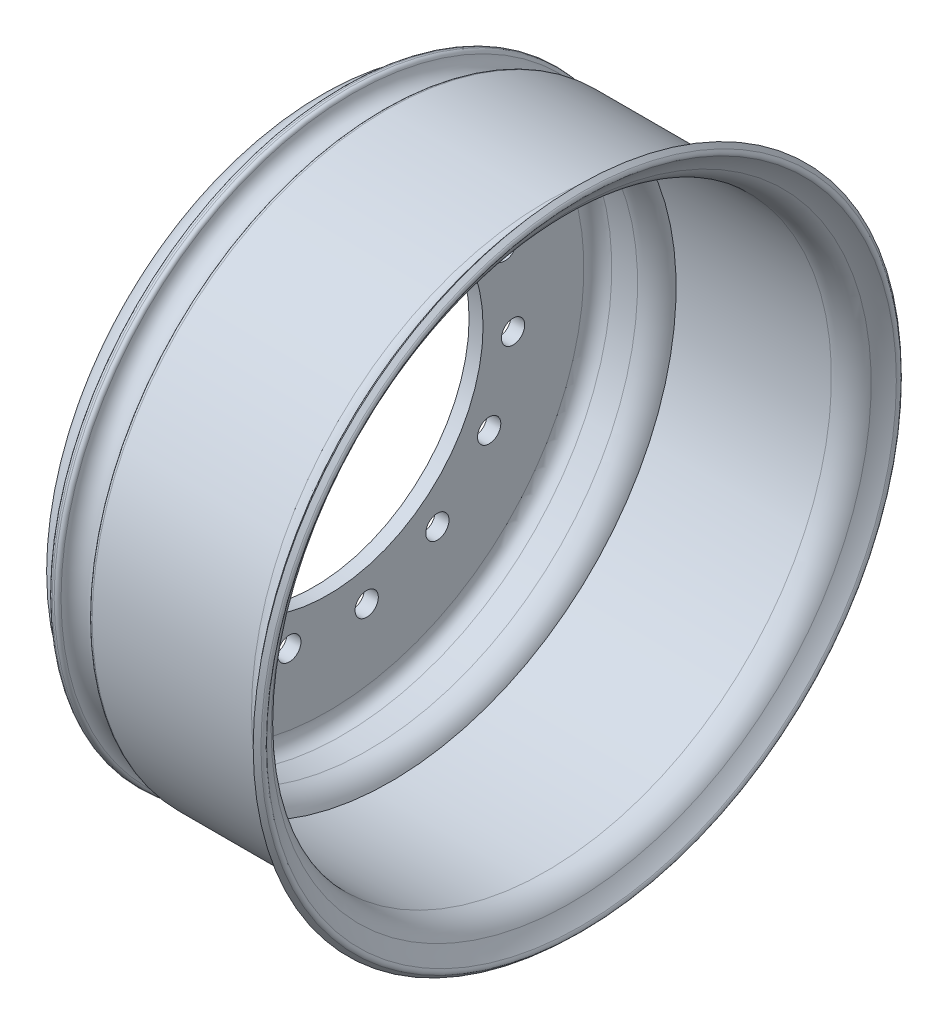
ISO-10303-21;
HEADER;
FILE_DESCRIPTION(('STEP AP214'),'2;1');
FILE_NAME('part.step','',(''),(''),'','','');
FILE_SCHEMA(('AUTOMOTIVE_DESIGN { 1 0 10303 214 1 1 1 1 }'));
ENDSEC;
DATA;
#1=APPLICATION_CONTEXT('core data for automotive mechanical design processes');
#2=APPLICATION_PROTOCOL_DEFINITION('international standard','automotive_design',2000,#1);
#3=PRODUCT_CONTEXT('',#1,'mechanical');
#4=PRODUCT('Part','Part','',(#3));
#5=PRODUCT_RELATED_PRODUCT_CATEGORY('part','',(#4));
#6=PRODUCT_DEFINITION_FORMATION('','',#4);
#7=PRODUCT_DEFINITION_CONTEXT('part definition',#1,'design');
#8=PRODUCT_DEFINITION('design','',#6,#7);
#9=PRODUCT_DEFINITION_SHAPE('','',#8);
#10=(LENGTH_UNIT() NAMED_UNIT(*) SI_UNIT(.MILLI.,.METRE.));
#11=(NAMED_UNIT(*) PLANE_ANGLE_UNIT() SI_UNIT($,.RADIAN.));
#12=(NAMED_UNIT(*) SI_UNIT($,.STERADIAN.) SOLID_ANGLE_UNIT());
#13=UNCERTAINTY_MEASURE_WITH_UNIT(LENGTH_MEASURE(1.E-05),#10,'distance_accuracy_value','');
#14=(GEOMETRIC_REPRESENTATION_CONTEXT(3) GLOBAL_UNCERTAINTY_ASSIGNED_CONTEXT((#13)) GLOBAL_UNIT_ASSIGNED_CONTEXT((#10,
#11,#12)) REPRESENTATION_CONTEXT('',''));
#15=CARTESIAN_POINT('',(0.,0.,0.));
#16=DIRECTION('',(0.,0.,1.));
#17=DIRECTION('',(1.,0.,0.));
#18=AXIS2_PLACEMENT_3D('',#15,#16,#17);
#19=CARTESIAN_POINT('',(16.,0.,0.));
#20=DIRECTION('',(-1.,0.,0.));
#21=DIRECTION('',(0.,0.,1.));
#22=AXIS2_PLACEMENT_3D('',#19,#20,#21);
#23=TOROIDAL_SURFACE('',#22,190.,10.);
#24=CARTESIAN_POINT('',(25.7979589711458,0.,0.));
#25=DIRECTION('',(-1.,0.,0.));
#26=DIRECTION('',(0.,0.,1.));
#27=AXIS2_PLACEMENT_3D('',#24,#25,#26);
#28=CIRCLE('',#27,187.999999999997);
#29=CARTESIAN_POINT('',(25.7979589711458,0.,187.999999999997));
#30=VERTEX_POINT('',#29);
#31=EDGE_CURVE('E55',#30,#30,#28,.T.);
#32=ORIENTED_EDGE('',*,*,#31,.T.);
#33=EDGE_LOOP('',(#32));
#34=FACE_BOUND('',#33,.T.);
#35=CARTESIAN_POINT('',(6.20204102885423,0.,0.));
#36=DIRECTION('',(1.,0.,0.));
#37=DIRECTION('',(0.,0.,-1.));
#38=AXIS2_PLACEMENT_3D('',#35,#36,#37);
#39=CIRCLE('',#38,187.999999999997);
#40=CARTESIAN_POINT('',(6.20204102885423,0.,-187.999999999997));
#41=VERTEX_POINT('',#40);
#42=EDGE_CURVE('E58',#41,#41,#39,.T.);
#43=ORIENTED_EDGE('',*,*,#42,.T.);
#44=EDGE_LOOP('',(#43));
#45=FACE_BOUND('',#44,.T.);
#46=ADVANCED_FACE('F35',(#34,#45),#23,.F.);
#47=CARTESIAN_POINT('',(0.,0.,0.));
#48=DIRECTION('',(-1.,0.,0.));
#49=DIRECTION('',(0.,0.,1.));
#50=AXIS2_PLACEMENT_3D('',#47,#48,#49);
#51=CYLINDRICAL_SURFACE('',#50,190.);
#52=CARTESIAN_POINT('',(28.2474487139159,0.,0.));
#53=DIRECTION('',(1.,0.,0.));
#54=DIRECTION('',(0.,0.,-1.));
#55=AXIS2_PLACEMENT_3D('',#52,#53,#54);
#56=CIRCLE('',#55,190.);
#57=CARTESIAN_POINT('',(28.2474487139159,0.,-190.));
#58=VERTEX_POINT('',#57);
#59=EDGE_CURVE('E50',#58,#58,#56,.T.);
#60=ORIENTED_EDGE('',*,*,#59,.T.);
#61=EDGE_LOOP('',(#60));
#62=FACE_BOUND('',#61,.T.);
#63=CARTESIAN_POINT('',(131.,0.,0.));
#64=DIRECTION('',(-1.,0.,0.));
#65=DIRECTION('',(0.,0.,1.));
#66=AXIS2_PLACEMENT_3D('',#63,#64,#65);
#67=CIRCLE('',#66,190.);
#68=CARTESIAN_POINT('',(131.,0.,190.));
#69=VERTEX_POINT('',#68);
#70=EDGE_CURVE('E67',#69,#69,#67,.T.);
#71=ORIENTED_EDGE('',*,*,#70,.T.);
#72=EDGE_LOOP('',(#71));
#73=FACE_BOUND('',#72,.T.);
#74=ADVANCED_FACE('F265',(#62,#73),#51,.T.);
#75=CARTESIAN_POINT('',(131.,0.,0.));
#76=DIRECTION('',(-1.,0.,0.));
#77=DIRECTION('',(0.,0.,1.));
#78=AXIS2_PLACEMENT_3D('',#75,#76,#77);
#79=TOROIDAL_SURFACE('',#78,202.5,12.5);
#80=ORIENTED_EDGE('',*,*,#70,.F.);
#81=EDGE_LOOP('',(#80));
#82=FACE_BOUND('',#81,.T.);
#83=CARTESIAN_POINT('',(141.912662215864,0.,0.));
#84=DIRECTION('',(-1.,0.,0.));
#85=DIRECTION('',(0.,0.,1.));
#86=AXIS2_PLACEMENT_3D('',#83,#84,#85);
#87=CIRCLE('',#86,196.403787785644);
#88=CARTESIAN_POINT('',(141.912662215864,0.,196.403787785644));
#89=VERTEX_POINT('',#88);
#90=EDGE_CURVE('E70',#89,#89,#87,.T.);
#91=ORIENTED_EDGE('',*,*,#90,.T.);
#92=EDGE_LOOP('',(#91));
#93=FACE_BOUND('',#92,.T.);
#94=ADVANCED_FACE('F271',(#82,#93),#79,.F.);
#95=CARTESIAN_POINT('',(198.658505738355,0.,0.));
#96=DIRECTION('',(-1.,0.,0.));
#97=DIRECTION('',(0.,0.,1.));
#98=AXIS2_PLACEMENT_3D('',#95,#96,#97);
#99=TOROIDAL_SURFACE('',#98,164.703484270994,65.);
#100=ORIENTED_EDGE('',*,*,#90,.F.);
#101=EDGE_LOOP('',(#100));
#102=FACE_BOUND('',#101,.T.);
#103=CARTESIAN_POINT('',(151.,0.,0.));
#104=DIRECTION('',(-1.,0.,0.));
#105=DIRECTION('',(0.,0.,1.));
#106=AXIS2_PLACEMENT_3D('',#103,#104,#105);
#107=CIRCLE('',#106,208.903787785644);
#108=CARTESIAN_POINT('',(151.,0.,208.903787785644));
#109=VERTEX_POINT('',#108);
#110=EDGE_CURVE('E73',#109,#109,#107,.T.);
#111=ORIENTED_EDGE('',*,*,#110,.T.);
#112=EDGE_LOOP('',(#111));
#113=FACE_BOUND('',#112,.T.);
#114=ADVANCED_FACE('F374',(#102,#113),#99,.T.);
#115=CARTESIAN_POINT('',(155.39924668354,0.,0.));
#116=DIRECTION('',(-1.,0.,0.));
#117=DIRECTION('',(0.,0.,1.));
#118=AXIS2_PLACEMENT_3D('',#115,#116,#117);
#119=CONICAL_SURFACE('',#118,204.823759768907,0.747769003171668);
#120=CARTESIAN_POINT('',(153.603499128886,0.,0.));
#121=DIRECTION('',(1.,0.,0.));
#122=DIRECTION('',(0.,0.,-1.));
#123=AXIS2_PLACEMENT_3D('',#120,#121,#122);
#124=CIRCLE('',#123,206.489204073586);
#125=CARTESIAN_POINT('',(153.603499128886,0.,-206.489204073586));
#126=VERTEX_POINT('',#125);
#127=EDGE_CURVE('E64',#126,#126,#124,.F.);
#128=ORIENTED_EDGE('',*,*,#127,.T.);
#129=EDGE_LOOP('',(#128));
#130=FACE_BOUND('',#129,.T.);
#131=ORIENTED_EDGE('',*,*,#110,.F.);
#132=EDGE_LOOP('',(#131));
#133=FACE_BOUND('',#132,.T.);
#134=ADVANCED_FACE('F361',(#130,#133),#119,.T.);
#135=CARTESIAN_POINT('',(198.658505738355,0.,0.));
#136=DIRECTION('',(-1.,0.,0.));
#137=DIRECTION('',(0.,0.,1.));
#138=AXIS2_PLACEMENT_3D('',#135,#136,#137);
#139=TOROIDAL_SURFACE('',#138,164.703484270994,59.);
#140=CARTESIAN_POINT('',(153.804097954559,0.,0.));
#141=DIRECTION('',(1.,0.,0.));
#142=DIRECTION('',(0.,0.,-1.));
#143=AXIS2_PLACEMENT_3D('',#140,#141,#142);
#144=CIRCLE('',#143,203.032091111903);
#145=CARTESIAN_POINT('',(153.804097954559,0.,-203.032091111903));
#146=VERTEX_POINT('',#145);
#147=EDGE_CURVE('E61',#146,#146,#144,.T.);
#148=ORIENTED_EDGE('',*,*,#147,.T.);
#149=EDGE_LOOP('',(#148));
#150=FACE_BOUND('',#149,.T.);
#151=CARTESIAN_POINT('',(147.150740079478,0.,0.));
#152=DIRECTION('',(-1.,0.,0.));
#153=DIRECTION('',(0.,0.,1.));
#154=AXIS2_PLACEMENT_3D('',#151,#152,#153);
#155=CIRCLE('',#154,193.477605922753);
#156=CARTESIAN_POINT('',(147.150740079478,0.,193.477605922753));
#157=VERTEX_POINT('',#156);
#158=EDGE_CURVE('E76',#157,#157,#155,.T.);
#159=ORIENTED_EDGE('',*,*,#158,.T.);
#160=EDGE_LOOP('',(#159));
#161=FACE_BOUND('',#160,.T.);
#162=ADVANCED_FACE('F355',(#150,#161),#139,.F.);
#163=CARTESIAN_POINT('',(131.,0.,0.));
#164=DIRECTION('',(-1.,0.,0.));
#165=DIRECTION('',(0.,0.,1.));
#166=AXIS2_PLACEMENT_3D('',#163,#164,#165);
#167=TOROIDAL_SURFACE('',#166,202.5,18.5);
#168=ORIENTED_EDGE('',*,*,#158,.F.);
#169=EDGE_LOOP('',(#168));
#170=FACE_BOUND('',#169,.T.);
#171=CARTESIAN_POINT('',(131.,0.,0.));
#172=DIRECTION('',(-1.,0.,0.));
#173=DIRECTION('',(0.,0.,1.));
#174=AXIS2_PLACEMENT_3D('',#171,#172,#173);
#175=CIRCLE('',#174,184.);
#176=CARTESIAN_POINT('',(131.,0.,184.));
#177=VERTEX_POINT('',#176);
#178=EDGE_CURVE('E79',#177,#177,#175,.T.);
#179=ORIENTED_EDGE('',*,*,#178,.T.);
#180=EDGE_LOOP('',(#179));
#181=FACE_BOUND('',#180,.T.);
#182=ADVANCED_FACE('F360',(#170,#181),#167,.T.);
#183=CARTESIAN_POINT('',(0.,0.,0.));
#184=DIRECTION('',(-1.,0.,0.));
#185=DIRECTION('',(0.,0.,1.));
#186=AXIS2_PLACEMENT_3D('',#183,#184,#185);
#187=CYLINDRICAL_SURFACE('',#186,184.);
#188=ORIENTED_EDGE('',*,*,#178,.F.);
#189=EDGE_LOOP('',(#188));
#190=FACE_BOUND('',#189,.T.);
#191=CARTESIAN_POINT('',(30.8323969741913,0.,0.));
#192=DIRECTION('',(-1.,0.,0.));
#193=DIRECTION('',(0.,0.,1.));
#194=AXIS2_PLACEMENT_3D('',#191,#192,#193);
#195=CIRCLE('',#194,184.);
#196=CARTESIAN_POINT('',(30.8323969741913,0.,184.));
#197=VERTEX_POINT('',#196);
#198=EDGE_CURVE('E82',#197,#197,#195,.T.);
#199=ORIENTED_EDGE('',*,*,#198,.T.);
#200=EDGE_LOOP('',(#199));
#201=FACE_BOUND('',#200,.T.);
#202=ADVANCED_FACE('F622',(#190,#201),#187,.F.);
#203=CARTESIAN_POINT('',(16.,0.,0.));
#204=DIRECTION('',(-1.,0.,0.));
#205=DIRECTION('',(0.,0.,1.));
#206=AXIS2_PLACEMENT_3D('',#203,#204,#205);
#207=TOROIDAL_SURFACE('',#206,190.,16.);
#208=ORIENTED_EDGE('',*,*,#198,.F.);
#209=EDGE_LOOP('',(#208));
#210=FACE_BOUND('',#209,.T.);
#211=CARTESIAN_POINT('',(16.,0.,0.));
#212=DIRECTION('',(-1.,0.,0.));
#213=DIRECTION('',(0.,0.,1.));
#214=AXIS2_PLACEMENT_3D('',#211,#212,#213);
#215=CIRCLE('',#214,174.);
#216=CARTESIAN_POINT('',(16.,0.,174.));
#217=VERTEX_POINT('',#216);
#218=EDGE_CURVE('E85',#217,#217,#215,.T.);
#219=ORIENTED_EDGE('',*,*,#218,.T.);
#220=EDGE_LOOP('',(#219));
#221=FACE_BOUND('',#220,.T.);
#222=ADVANCED_FACE('F611',(#210,#221),#207,.T.);
#223=CARTESIAN_POINT('',(0.,0.,0.));
#224=DIRECTION('',(-1.,0.,0.));
#225=DIRECTION('',(0.,0.,1.));
#226=AXIS2_PLACEMENT_3D('',#223,#224,#225);
#227=CYLINDRICAL_SURFACE('',#226,174.);
#228=ORIENTED_EDGE('',*,*,#218,.F.);
#229=EDGE_LOOP('',(#228));
#230=FACE_BOUND('',#229,.T.);
#231=CARTESIAN_POINT('',(-0.654113463673033,0.,0.));
#232=DIRECTION('',(-1.,0.,0.));
#233=DIRECTION('',(0.,0.,1.));
#234=AXIS2_PLACEMENT_3D('',#231,#232,#233);
#235=CIRCLE('',#234,174.);
#236=CARTESIAN_POINT('',(-0.654113463673033,0.,174.));
#237=VERTEX_POINT('',#236);
#238=EDGE_CURVE('E88',#237,#237,#235,.T.);
#239=ORIENTED_EDGE('',*,*,#238,.T.);
#240=EDGE_LOOP('',(#239));
#241=FACE_BOUND('',#240,.T.);
#242=ADVANCED_FACE('F600',(#230,#241),#227,.F.);
#243=CARTESIAN_POINT('',(-0.654113463673034,0.,0.));
#244=DIRECTION('',(-1.,0.,0.));
#245=DIRECTION('',(0.,0.,1.));
#246=AXIS2_PLACEMENT_3D('',#243,#244,#245);
#247=TOROIDAL_SURFACE('',#246,165.,9.00000000000001);
#248=ORIENTED_EDGE('',*,*,#238,.F.);
#249=EDGE_LOOP('',(#248));
#250=FACE_BOUND('',#249,.T.);
#251=CARTESIAN_POINT('',(-9.65411346367303,0.,0.));
#252=DIRECTION('',(-1.,0.,0.));
#253=DIRECTION('',(0.,0.,1.));
#254=AXIS2_PLACEMENT_3D('',#251,#252,#253);
#255=CIRCLE('',#254,165.);
#256=CARTESIAN_POINT('',(-9.65411346367303,0.,165.));
#257=VERTEX_POINT('',#256);
#258=EDGE_CURVE('E91',#257,#257,#255,.T.);
#259=ORIENTED_EDGE('',*,*,#258,.T.);
#260=EDGE_LOOP('',(#259));
#261=FACE_BOUND('',#260,.T.);
#262=ADVANCED_FACE('F547',(#250,#261),#247,.F.);
#263=CARTESIAN_POINT('',(-9.65411346367303,165.,0.));
#264=DIRECTION('',(-1.,0.,0.));
#265=DIRECTION('',(0.,0.,1.));
#266=AXIS2_PLACEMENT_3D('',#263,#264,#265);
#267=PLANE('',#266);
#268=CARTESIAN_POINT('',(-9.65411346367304,80.2956727630628,-89.1773790572875));
#269=DIRECTION('',(-1.,0.,0.));
#270=DIRECTION('',(0.,0.,1.));
#271=AXIS2_PLACEMENT_3D('',#268,#269,#270);
#272=CIRCLE('',#271,7.5);
#273=CARTESIAN_POINT('',(-9.65411346367304,80.2956727630628,-81.6773790572875));
#274=VERTEX_POINT('',#273);
#275=EDGE_CURVE('E121',#274,#274,#272,.T.);
#276=ORIENTED_EDGE('',*,*,#275,.T.);
#277=EDGE_LOOP('',(#276));
#278=FACE_BOUND('',#277,.T.);
#279=CARTESIAN_POINT('',(-9.65411346367304,37.0820393249934,-114.126781955419));
#280=DIRECTION('',(-1.,0.,0.));
#281=DIRECTION('',(0.,0.,1.));
#282=AXIS2_PLACEMENT_3D('',#279,#280,#281);
#283=CIRCLE('',#282,7.5);
#284=CARTESIAN_POINT('',(-9.65411346367304,37.0820393249934,-106.626781955419));
#285=VERTEX_POINT('',#284);
#286=EDGE_CURVE('E124',#285,#285,#283,.T.);
#287=ORIENTED_EDGE('',*,*,#286,.T.);
#288=EDGE_LOOP('',(#287));
#289=FACE_BOUND('',#288,.T.);
#290=CARTESIAN_POINT('',(-9.65411346367304,-12.5434155921189,-119.342627444193));
#291=DIRECTION('',(-1.,0.,0.));
#292=DIRECTION('',(0.,0.,1.));
#293=AXIS2_PLACEMENT_3D('',#290,#291,#292);
#294=CIRCLE('',#293,7.5);
#295=CARTESIAN_POINT('',(-9.65411346367304,-12.5434155921189,-111.842627444193));
#296=VERTEX_POINT('',#295);
#297=EDGE_CURVE('E127',#296,#296,#294,.T.);
#298=ORIENTED_EDGE('',*,*,#297,.T.);
#299=EDGE_LOOP('',(#298));
#300=FACE_BOUND('',#299,.T.);
#301=CARTESIAN_POINT('',(-9.65411346367304,-60.0000000000005,-103.923048454132));
#302=DIRECTION('',(-1.,0.,0.));
#303=DIRECTION('',(0.,0.,1.));
#304=AXIS2_PLACEMENT_3D('',#301,#302,#303);
#305=CIRCLE('',#304,7.5);
#306=CARTESIAN_POINT('',(-9.65411346367304,-60.0000000000005,-96.4230484541324));
#307=VERTEX_POINT('',#306);
#308=EDGE_CURVE('E130',#307,#307,#305,.T.);
#309=ORIENTED_EDGE('',*,*,#308,.T.);
#310=EDGE_LOOP('',(#309));
#311=FACE_BOUND('',#310,.T.);
#312=CARTESIAN_POINT('',(-9.65411346367304,-97.0820393249941,-70.5342302750963));
#313=DIRECTION('',(-1.,0.,0.));
#314=DIRECTION('',(0.,0.,1.));
#315=AXIS2_PLACEMENT_3D('',#312,#313,#314);
#316=CIRCLE('',#315,7.5);
#317=CARTESIAN_POINT('',(-9.65411346367304,-97.0820393249941,-63.0342302750963));
#318=VERTEX_POINT('',#317);
#319=EDGE_CURVE('E133',#318,#318,#316,.T.);
#320=ORIENTED_EDGE('',*,*,#319,.T.);
#321=EDGE_LOOP('',(#320));
#322=FACE_BOUND('',#321,.T.);
#323=CARTESIAN_POINT('',(-9.65411346367304,-117.377712088057,-24.9494028981304));
#324=DIRECTION('',(-1.,0.,0.));
#325=DIRECTION('',(0.,0.,1.));
#326=AXIS2_PLACEMENT_3D('',#323,#324,#325);
#327=CIRCLE('',#326,7.5);
#328=CARTESIAN_POINT('',(-9.65411346367304,-117.377712088057,-17.4494028981304));
#329=VERTEX_POINT('',#328);
#330=EDGE_CURVE('E136',#329,#329,#327,.T.);
#331=ORIENTED_EDGE('',*,*,#330,.T.);
#332=EDGE_LOOP('',(#331));
#333=FACE_BOUND('',#332,.T.);
#334=CARTESIAN_POINT('',(-9.65411346367304,-117.377712088056,24.949402898132));
#335=DIRECTION('',(-1.,0.,0.));
#336=DIRECTION('',(0.,0.,1.));
#337=AXIS2_PLACEMENT_3D('',#334,#335,#336);
#338=CIRCLE('',#337,7.5);
#339=CARTESIAN_POINT('',(-9.65411346367304,-117.377712088056,32.449402898132));
#340=VERTEX_POINT('',#339);
#341=EDGE_CURVE('E139',#340,#340,#338,.T.);
#342=ORIENTED_EDGE('',*,*,#341,.T.);
#343=EDGE_LOOP('',(#342));
#344=FACE_BOUND('',#343,.T.);
#345=CARTESIAN_POINT('',(-9.65411346367304,-97.0820393249931,70.5342302750976));
#346=DIRECTION('',(-1.,0.,0.));
#347=DIRECTION('',(0.,0.,1.));
#348=AXIS2_PLACEMENT_3D('',#345,#346,#347);
#349=CIRCLE('',#348,7.5);
#350=CARTESIAN_POINT('',(-9.65411346367304,-97.0820393249931,78.0342302750976));
#351=VERTEX_POINT('',#350);
#352=EDGE_CURVE('E142',#351,#351,#349,.T.);
#353=ORIENTED_EDGE('',*,*,#352,.T.);
#354=EDGE_LOOP('',(#353));
#355=FACE_BOUND('',#354,.T.);
#356=CARTESIAN_POINT('',(-9.65411346367304,-59.999999999999,103.923048454133));
#357=DIRECTION('',(-1.,0.,0.));
#358=DIRECTION('',(0.,0.,1.));
#359=AXIS2_PLACEMENT_3D('',#356,#357,#358);
#360=CIRCLE('',#359,7.5);
#361=CARTESIAN_POINT('',(-9.65411346367304,-59.999999999999,111.423048454133));
#362=VERTEX_POINT('',#361);
#363=EDGE_CURVE('E145',#362,#362,#360,.T.);
#364=ORIENTED_EDGE('',*,*,#363,.T.);
#365=EDGE_LOOP('',(#364));
#366=FACE_BOUND('',#365,.T.);
#367=CARTESIAN_POINT('',(-9.65411346367304,-12.5434155921172,119.342627444193));
#368=DIRECTION('',(-1.,0.,0.));
#369=DIRECTION('',(0.,0.,1.));
#370=AXIS2_PLACEMENT_3D('',#367,#368,#369);
#371=CIRCLE('',#370,7.5);
#372=CARTESIAN_POINT('',(-9.65411346367304,-12.5434155921172,126.842627444193));
#373=VERTEX_POINT('',#372);
#374=EDGE_CURVE('E148',#373,#373,#371,.T.);
#375=ORIENTED_EDGE('',*,*,#374,.T.);
#376=EDGE_LOOP('',(#375));
#377=FACE_BOUND('',#376,.T.);
#378=CARTESIAN_POINT('',(-9.65411346367304,37.0820393249949,114.126781955418));
#379=DIRECTION('',(-1.,0.,0.));
#380=DIRECTION('',(0.,0.,1.));
#381=AXIS2_PLACEMENT_3D('',#378,#379,#380);
#382=CIRCLE('',#381,7.5);
#383=CARTESIAN_POINT('',(-9.65411346367304,37.0820393249949,121.626781955418));
#384=VERTEX_POINT('',#383);
#385=EDGE_CURVE('E151',#384,#384,#382,.T.);
#386=ORIENTED_EDGE('',*,*,#385,.T.);
#387=EDGE_LOOP('',(#386));
#388=FACE_BOUND('',#387,.T.);
#389=CARTESIAN_POINT('',(-9.65411346367304,80.2956727630641,89.1773790572863));
#390=DIRECTION('',(-1.,0.,0.));
#391=DIRECTION('',(0.,0.,1.));
#392=AXIS2_PLACEMENT_3D('',#389,#390,#391);
#393=CIRCLE('',#392,7.5);
#394=CARTESIAN_POINT('',(-9.65411346367304,80.2956727630641,96.6773790572863));
#395=VERTEX_POINT('',#394);
#396=EDGE_CURVE('E154',#395,#395,#393,.T.);
#397=ORIENTED_EDGE('',*,*,#396,.T.);
#398=EDGE_LOOP('',(#397));
#399=FACE_BOUND('',#398,.T.);
#400=CARTESIAN_POINT('',(-9.65411346367304,109.625454917113,48.8083971690947));
#401=DIRECTION('',(-1.,0.,0.));
#402=DIRECTION('',(0.,0.,1.));
#403=AXIS2_PLACEMENT_3D('',#400,#401,#402);
#404=CIRCLE('',#403,7.5);
#405=CARTESIAN_POINT('',(-9.65411346367304,109.625454917113,56.3083971690947));
#406=VERTEX_POINT('',#405);
#407=EDGE_CURVE('E157',#406,#406,#404,.T.);
#408=ORIENTED_EDGE('',*,*,#407,.T.);
#409=EDGE_LOOP('',(#408));
#410=FACE_BOUND('',#409,.T.);
#411=CARTESIAN_POINT('',(-9.65411346367304,109.625454917112,-48.8083971690961));
#412=DIRECTION('',(-1.,0.,0.));
#413=DIRECTION('',(0.,0.,1.));
#414=AXIS2_PLACEMENT_3D('',#411,#412,#413);
#415=CIRCLE('',#414,7.5);
#416=CARTESIAN_POINT('',(-9.65411346367304,109.625454917112,-41.3083971690961));
#417=VERTEX_POINT('',#416);
#418=EDGE_CURVE('E160',#417,#417,#415,.T.);
#419=ORIENTED_EDGE('',*,*,#418,.T.);
#420=EDGE_LOOP('',(#419));
#421=FACE_BOUND('',#420,.T.);
#422=CARTESIAN_POINT('',(-9.65411346367304,120.,0.));
#423=DIRECTION('',(-1.,0.,0.));
#424=DIRECTION('',(0.,0.,1.));
#425=AXIS2_PLACEMENT_3D('',#422,#423,#424);
#426=CIRCLE('',#425,7.5);
#427=CARTESIAN_POINT('',(-9.65411346367304,120.,7.5));
#428=VERTEX_POINT('',#427);
#429=EDGE_CURVE('E115',#428,#428,#426,.T.);
#430=ORIENTED_EDGE('',*,*,#429,.T.);
#431=EDGE_LOOP('',(#430));
#432=FACE_BOUND('',#431,.T.);
#433=ORIENTED_EDGE('',*,*,#258,.F.);
#434=EDGE_LOOP('',(#433));
#435=FACE_BOUND('',#434,.T.);
#436=CARTESIAN_POINT('',(-9.65411346367302,0.,0.));
#437=DIRECTION('',(-1.,0.,0.));
#438=DIRECTION('',(0.,0.,1.));
#439=AXIS2_PLACEMENT_3D('',#436,#437,#438);
#440=CIRCLE('',#439,100.);
#441=CARTESIAN_POINT('',(-9.65411346367302,0.,100.));
#442=VERTEX_POINT('',#441);
#443=EDGE_CURVE('E94',#442,#442,#440,.T.);
#444=ORIENTED_EDGE('',*,*,#443,.T.);
#445=EDGE_LOOP('',(#444));
#446=FACE_BOUND('',#445,.T.);
#447=ADVANCED_FACE('F542',(#278,#289,#300,#311,#322,#333,#344,#355,#366,#377,#388,#399,#410,
#421,#432,#435,#446),#267,.F.);
#448=CARTESIAN_POINT('',(0.,0.,0.));
#449=DIRECTION('',(-1.,0.,0.));
#450=DIRECTION('',(0.,0.,1.));
#451=AXIS2_PLACEMENT_3D('',#448,#449,#450);
#452=CYLINDRICAL_SURFACE('',#451,100.);
#453=ORIENTED_EDGE('',*,*,#443,.F.);
#454=EDGE_LOOP('',(#453));
#455=FACE_BOUND('',#454,.T.);
#456=CARTESIAN_POINT('',(-18.654113463673,0.,0.));
#457=DIRECTION('',(-1.,0.,0.));
#458=DIRECTION('',(0.,0.,1.));
#459=AXIS2_PLACEMENT_3D('',#456,#457,#458);
#460=CIRCLE('',#459,100.);
#461=CARTESIAN_POINT('',(-18.654113463673,0.,100.));
#462=VERTEX_POINT('',#461);
#463=EDGE_CURVE('E97',#462,#462,#460,.T.);
#464=ORIENTED_EDGE('',*,*,#463,.T.);
#465=EDGE_LOOP('',(#464));
#466=FACE_BOUND('',#465,.T.);
#467=ADVANCED_FACE('F213',(#455,#466),#452,.F.);
#468=CARTESIAN_POINT('',(-18.654113463673,165.,0.));
#469=DIRECTION('',(1.,0.,0.));
#470=DIRECTION('',(0.,0.,-1.));
#471=AXIS2_PLACEMENT_3D('',#468,#469,#470);
#472=PLANE('',#471);
#473=CARTESIAN_POINT('',(-18.654113463673,80.2956727630628,-89.1773790572875));
#474=DIRECTION('',(-1.,0.,0.));
#475=DIRECTION('',(0.,0.743144825477395,0.669130606358857));
#476=AXIS2_PLACEMENT_3D('',#473,#474,#475);
#477=CIRCLE('',#476,7.5);
#478=CARTESIAN_POINT('',(-18.654113463673,85.8692589541433,-84.158899509596));
#479=VERTEX_POINT('',#478);
#480=EDGE_CURVE('E166',#479,#479,#477,.T.);
#481=ORIENTED_EDGE('',*,*,#480,.F.);
#482=EDGE_LOOP('',(#481));
#483=FACE_BOUND('',#482,.T.);
#484=CARTESIAN_POINT('',(-18.654113463673,37.0820393249934,-114.126781955419));
#485=DIRECTION('',(-1.,0.,0.));
#486=DIRECTION('',(0.,0.951056516295154,0.309016994374945));
#487=AXIS2_PLACEMENT_3D('',#484,#485,#486);
#488=CIRCLE('',#487,7.5);
#489=CARTESIAN_POINT('',(-18.654113463673,44.2149631972071,-111.809154497606));
#490=VERTEX_POINT('',#489);
#491=EDGE_CURVE('E186',#490,#490,#488,.T.);
#492=ORIENTED_EDGE('',*,*,#491,.F.);
#493=EDGE_LOOP('',(#492));
#494=FACE_BOUND('',#493,.T.);
#495=CARTESIAN_POINT('',(-18.654113463673,-12.5434155921189,-119.342627444193));
#496=DIRECTION('',(-1.,0.,0.));
#497=DIRECTION('',(0.,0.994521895368273,-0.104528463267657));
#498=AXIS2_PLACEMENT_3D('',#495,#496,#497);
#499=CIRCLE('',#498,7.5);
#500=CARTESIAN_POINT('',(-18.654113463673,-5.0845013768568,-120.1265909187));
#501=VERTEX_POINT('',#500);
#502=EDGE_CURVE('E183',#501,#501,#499,.T.);
#503=ORIENTED_EDGE('',*,*,#502,.F.);
#504=EDGE_LOOP('',(#503));
#505=FACE_BOUND('',#504,.T.);
#506=CARTESIAN_POINT('',(-18.654113463673,-60.0000000000005,-103.923048454132));
#507=DIRECTION('',(-1.,0.,0.));
#508=DIRECTION('',(0.,0.866025403784436,-0.500000000000004));
#509=AXIS2_PLACEMENT_3D('',#506,#507,#508);
#510=CIRCLE('',#509,7.5);
#511=CARTESIAN_POINT('',(-18.654113463673,-53.5048094716172,-107.673048454132));
#512=VERTEX_POINT('',#511);
#513=EDGE_CURVE('E180',#512,#512,#510,.T.);
#514=ORIENTED_EDGE('',*,*,#513,.F.);
#515=EDGE_LOOP('',(#514));
#516=FACE_BOUND('',#515,.T.);
#517=CARTESIAN_POINT('',(-18.654113463673,-97.0820393249941,-70.5342302750963));
#518=DIRECTION('',(-1.,0.,0.));
#519=DIRECTION('',(0.,0.587785252292469,-0.80901699437495));
#520=AXIS2_PLACEMENT_3D('',#517,#518,#519);
#521=CIRCLE('',#520,7.5);
#522=CARTESIAN_POINT('',(-18.654113463673,-92.6736499328005,-76.6018577329084));
#523=VERTEX_POINT('',#522);
#524=EDGE_CURVE('E177',#523,#523,#521,.T.);
#525=ORIENTED_EDGE('',*,*,#524,.F.);
#526=EDGE_LOOP('',(#525));
#527=FACE_BOUND('',#526,.T.);
#528=CARTESIAN_POINT('',(-18.654113463673,-117.377712088057,-24.9494028981304));
#529=DIRECTION('',(-1.,0.,0.));
#530=DIRECTION('',(0.,0.207911690817753,-0.978147600733807));
#531=AXIS2_PLACEMENT_3D('',#528,#529,#530);
#532=CIRCLE('',#531,7.5);
#533=CARTESIAN_POINT('',(-18.654113463673,-115.818374406924,-32.2855099036339));
#534=VERTEX_POINT('',#533);
#535=EDGE_CURVE('E174',#534,#534,#532,.T.);
#536=ORIENTED_EDGE('',*,*,#535,.F.);
#537=EDGE_LOOP('',(#536));
#538=FACE_BOUND('',#537,.T.);
#539=CARTESIAN_POINT('',(-18.654113463673,-117.377712088056,24.949402898132));
#540=DIRECTION('',(-1.,0.,0.));
#541=DIRECTION('',(0.,-0.207911690817766,-0.978147600733804));
#542=AXIS2_PLACEMENT_3D('',#539,#540,#541);
#543=CIRCLE('',#542,7.5);
#544=CARTESIAN_POINT('',(-18.654113463673,-118.93704976919,17.6132958926284));
#545=VERTEX_POINT('',#544);
#546=EDGE_CURVE('E170',#545,#545,#543,.T.);
#547=ORIENTED_EDGE('',*,*,#546,.F.);
#548=EDGE_LOOP('',(#547));
#549=FACE_BOUND('',#548,.T.);
#550=CARTESIAN_POINT('',(-18.654113463673,-97.0820393249931,70.5342302750976));
#551=DIRECTION('',(-1.,0.,0.));
#552=DIRECTION('',(0.,-0.58778525229248,-0.809016994374943));
#553=AXIS2_PLACEMENT_3D('',#550,#551,#552);
#554=CIRCLE('',#553,7.5);
#555=CARTESIAN_POINT('',(-18.654113463673,-101.490428717187,64.4666028172855));
#556=VERTEX_POINT('',#555);
#557=EDGE_CURVE('E167',#556,#556,#554,.T.);
#558=ORIENTED_EDGE('',*,*,#557,.F.);
#559=EDGE_LOOP('',(#558));
#560=FACE_BOUND('',#559,.T.);
#561=CARTESIAN_POINT('',(-18.654113463673,-59.999999999999,103.923048454133));
#562=DIRECTION('',(-1.,0.,0.));
#563=DIRECTION('',(0.,-0.866025403784443,-0.499999999999992));
#564=AXIS2_PLACEMENT_3D('',#561,#562,#563);
#565=CIRCLE('',#564,7.5);
#566=CARTESIAN_POINT('',(-18.654113463673,-66.4951905283824,100.173048454133));
#567=VERTEX_POINT('',#566);
#568=EDGE_CURVE('E171',#567,#567,#565,.T.);
#569=ORIENTED_EDGE('',*,*,#568,.F.);
#570=EDGE_LOOP('',(#569));
#571=FACE_BOUND('',#570,.T.);
#572=CARTESIAN_POINT('',(-18.654113463673,-12.5434155921172,119.342627444193));
#573=DIRECTION('',(-1.,0.,0.));
#574=DIRECTION('',(0.,-0.994521895368274,-0.104528463267644));
#575=AXIS2_PLACEMENT_3D('',#572,#573,#574);
#576=CIRCLE('',#575,7.5);
#577=CARTESIAN_POINT('',(-18.654113463673,-20.0023298073793,118.558663969686));
#578=VERTEX_POINT('',#577);
#579=EDGE_CURVE('E200',#578,#578,#576,.T.);
#580=ORIENTED_EDGE('',*,*,#579,.F.);
#581=EDGE_LOOP('',(#580));
#582=FACE_BOUND('',#581,.T.);
#583=CARTESIAN_POINT('',(-18.654113463673,37.0820393249949,114.126781955418));
#584=DIRECTION('',(-1.,0.,0.));
#585=DIRECTION('',(0.,-0.95105651629515,0.309016994374957));
#586=AXIS2_PLACEMENT_3D('',#583,#584,#585);
#587=CIRCLE('',#586,7.5);
#588=CARTESIAN_POINT('',(-18.654113463673,29.9491154527813,116.44440941323));
#589=VERTEX_POINT('',#588);
#590=EDGE_CURVE('E197',#589,#589,#587,.T.);
#591=ORIENTED_EDGE('',*,*,#590,.F.);
#592=EDGE_LOOP('',(#591));
#593=FACE_BOUND('',#592,.T.);
#594=CARTESIAN_POINT('',(-18.654113463673,80.2956727630641,89.1773790572863));
#595=DIRECTION('',(-1.,0.,0.));
#596=DIRECTION('',(0.,-0.743144825477386,0.669130606358867));
#597=AXIS2_PLACEMENT_3D('',#594,#595,#596);
#598=CIRCLE('',#597,7.5);
#599=CARTESIAN_POINT('',(-18.654113463673,74.7220865719837,94.1958586049779));
#600=VERTEX_POINT('',#599);
#601=EDGE_CURVE('E194',#600,#600,#598,.T.);
#602=ORIENTED_EDGE('',*,*,#601,.F.);
#603=EDGE_LOOP('',(#602));
#604=FACE_BOUND('',#603,.T.);
#605=CARTESIAN_POINT('',(-18.654113463673,109.625454917113,48.8083971690947));
#606=DIRECTION('',(-1.,0.,0.));
#607=DIRECTION('',(0.,-0.406736643075789,0.913545457642606));
#608=AXIS2_PLACEMENT_3D('',#605,#606,#607);
#609=CIRCLE('',#608,7.5);
#610=CARTESIAN_POINT('',(-18.654113463673,106.574930094044,55.6599881014142));
#611=VERTEX_POINT('',#610);
#612=EDGE_CURVE('E191',#611,#611,#609,.T.);
#613=ORIENTED_EDGE('',*,*,#612,.F.);
#614=EDGE_LOOP('',(#613));
#615=FACE_BOUND('',#614,.T.);
#616=CARTESIAN_POINT('',(-18.654113463673,109.625454917112,-48.8083971690961));
#617=DIRECTION('',(-1.,0.,0.));
#618=DIRECTION('',(0.,0.406736643075801,0.913545457642601));
#619=AXIS2_PLACEMENT_3D('',#616,#617,#618);
#620=CIRCLE('',#619,7.5);
#621=CARTESIAN_POINT('',(-18.654113463673,112.675979740181,-41.9568062367766));
#622=VERTEX_POINT('',#621);
#623=EDGE_CURVE('E163',#622,#622,#620,.T.);
#624=ORIENTED_EDGE('',*,*,#623,.F.);
#625=EDGE_LOOP('',(#624));
#626=FACE_BOUND('',#625,.T.);
#627=CARTESIAN_POINT('',(-18.654113463673,120.,0.));
#628=DIRECTION('',(-1.,0.,0.));
#629=DIRECTION('',(0.,0.,1.));
#630=AXIS2_PLACEMENT_3D('',#627,#628,#629);
#631=CIRCLE('',#630,7.5);
#632=CARTESIAN_POINT('',(-18.654113463673,120.,7.5));
#633=VERTEX_POINT('',#632);
#634=EDGE_CURVE('E118',#633,#633,#631,.T.);
#635=ORIENTED_EDGE('',*,*,#634,.F.);
#636=EDGE_LOOP('',(#635));
#637=FACE_BOUND('',#636,.T.);
#638=ORIENTED_EDGE('',*,*,#463,.F.);
#639=EDGE_LOOP('',(#638));
#640=FACE_BOUND('',#639,.T.);
#641=CARTESIAN_POINT('',(-18.654113463673,0.,0.));
#642=DIRECTION('',(-1.,0.,0.));
#643=DIRECTION('',(0.,0.,1.));
#644=AXIS2_PLACEMENT_3D('',#641,#642,#643);
#645=CIRCLE('',#644,165.);
#646=CARTESIAN_POINT('',(-18.654113463673,0.,165.));
#647=VERTEX_POINT('',#646);
#648=EDGE_CURVE('E100',#647,#647,#645,.T.);
#649=ORIENTED_EDGE('',*,*,#648,.T.);
#650=EDGE_LOOP('',(#649));
#651=FACE_BOUND('',#650,.T.);
#652=ADVANCED_FACE('F209',(#483,#494,#505,#516,#527,#538,#549,#560,#571,#582,#593,#604,#615,
#626,#637,#640,#651),#472,.F.);
#653=CARTESIAN_POINT('',(-0.654113463673032,0.,0.));
#654=DIRECTION('',(-1.,0.,0.));
#655=DIRECTION('',(0.,0.,1.));
#656=AXIS2_PLACEMENT_3D('',#653,#654,#655);
#657=TOROIDAL_SURFACE('',#656,165.,18.);
#658=ORIENTED_EDGE('',*,*,#648,.F.);
#659=EDGE_LOOP('',(#658));
#660=FACE_BOUND('',#659,.T.);
#661=CARTESIAN_POINT('',(-0.654113463673034,0.,0.));
#662=DIRECTION('',(-1.,0.,0.));
#663=DIRECTION('',(0.,0.,1.));
#664=AXIS2_PLACEMENT_3D('',#661,#662,#663);
#665=CIRCLE('',#664,183.);
#666=CARTESIAN_POINT('',(-0.654113463673034,0.,183.));
#667=VERTEX_POINT('',#666);
#668=EDGE_CURVE('E103',#667,#667,#665,.T.);
#669=ORIENTED_EDGE('',*,*,#668,.T.);
#670=EDGE_LOOP('',(#669));
#671=FACE_BOUND('',#670,.T.);
#672=ADVANCED_FACE('F212',(#660,#671),#657,.T.);
#673=CARTESIAN_POINT('',(0.,0.,0.));
#674=DIRECTION('',(-1.,0.,0.));
#675=DIRECTION('',(0.,0.,1.));
#676=AXIS2_PLACEMENT_3D('',#673,#674,#675);
#677=CYLINDRICAL_SURFACE('',#676,183.);
#678=ORIENTED_EDGE('',*,*,#668,.F.);
#679=EDGE_LOOP('',(#678));
#680=FACE_BOUND('',#679,.T.);
#681=CARTESIAN_POINT('',(1.61250543006184,0.,0.));
#682=DIRECTION('',(-1.,0.,0.));
#683=DIRECTION('',(0.,0.,1.));
#684=AXIS2_PLACEMENT_3D('',#681,#682,#683);
#685=CIRCLE('',#684,183.);
#686=CARTESIAN_POINT('',(1.61250543006184,0.,183.));
#687=VERTEX_POINT('',#686);
#688=EDGE_CURVE('E106',#687,#687,#685,.T.);
#689=ORIENTED_EDGE('',*,*,#688,.T.);
#690=EDGE_LOOP('',(#689));
#691=FACE_BOUND('',#690,.T.);
#692=ADVANCED_FACE('F234',(#680,#691),#677,.T.);
#693=CARTESIAN_POINT('',(16.,0.,0.));
#694=DIRECTION('',(-1.,0.,0.));
#695=DIRECTION('',(0.,0.,1.));
#696=AXIS2_PLACEMENT_3D('',#693,#694,#695);
#697=TOROIDAL_SURFACE('',#696,190.,16.);
#698=ORIENTED_EDGE('',*,*,#688,.F.);
#699=EDGE_LOOP('',(#698));
#700=FACE_BOUND('',#699,.T.);
#701=CARTESIAN_POINT('',(1.16760302580867,0.,0.));
#702=DIRECTION('',(-1.,0.,0.));
#703=DIRECTION('',(0.,0.,1.));
#704=AXIS2_PLACEMENT_3D('',#701,#702,#703);
#705=CIRCLE('',#704,184.);
#706=CARTESIAN_POINT('',(1.16760302580867,0.,184.));
#707=VERTEX_POINT('',#706);
#708=EDGE_CURVE('E109',#707,#707,#705,.T.);
#709=ORIENTED_EDGE('',*,*,#708,.T.);
#710=EDGE_LOOP('',(#709));
#711=FACE_BOUND('',#710,.T.);
#712=ADVANCED_FACE('F240',(#700,#711),#697,.T.);
#713=CARTESIAN_POINT('',(0.,0.,0.));
#714=DIRECTION('',(-1.,0.,0.));
#715=DIRECTION('',(0.,0.,1.));
#716=AXIS2_PLACEMENT_3D('',#713,#714,#715);
#717=CYLINDRICAL_SURFACE('',#716,184.);
#718=ORIENTED_EDGE('',*,*,#708,.F.);
#719=EDGE_LOOP('',(#718));
#720=FACE_BOUND('',#719,.T.);
#721=CARTESIAN_POINT('',(0.,0.,0.));
#722=DIRECTION('',(-1.,0.,0.));
#723=DIRECTION('',(0.,0.,1.));
#724=AXIS2_PLACEMENT_3D('',#721,#722,#723);
#725=CIRCLE('',#724,184.);
#726=CARTESIAN_POINT('',(0.,0.,184.));
#727=VERTEX_POINT('',#726);
#728=EDGE_CURVE('E112',#727,#727,#725,.T.);
#729=ORIENTED_EDGE('',*,*,#728,.T.);
#730=EDGE_LOOP('',(#729));
#731=FACE_BOUND('',#730,.T.);
#732=ADVANCED_FACE('F246',(#720,#731),#717,.F.);
#733=CARTESIAN_POINT('',(0.,190.,0.));
#734=DIRECTION('',(1.,0.,0.));
#735=DIRECTION('',(0.,0.,-1.));
#736=AXIS2_PLACEMENT_3D('',#733,#734,#735);
#737=PLANE('',#736);
#738=CARTESIAN_POINT('',(0.,0.,0.));
#739=DIRECTION('',(1.,0.,0.));
#740=DIRECTION('',(0.,0.,-1.));
#741=AXIS2_PLACEMENT_3D('',#738,#739,#740);
#742=CIRCLE('',#741,187.5);
#743=CARTESIAN_POINT('',(0.,0.,-187.5));
#744=VERTEX_POINT('',#743);
#745=EDGE_CURVE('E42',#744,#744,#742,.F.);
#746=ORIENTED_EDGE('',*,*,#745,.T.);
#747=EDGE_LOOP('',(#746));
#748=FACE_BOUND('',#747,.T.);
#749=ORIENTED_EDGE('',*,*,#728,.F.);
#750=EDGE_LOOP('',(#749));
#751=FACE_BOUND('',#750,.T.);
#752=ADVANCED_FACE('F252',(#748,#751),#737,.F.);
#753=CARTESIAN_POINT('',(0.,0.,0.));
#754=DIRECTION('',(-1.,0.,0.));
#755=DIRECTION('',(0.,0.,1.));
#756=AXIS2_PLACEMENT_3D('',#753,#754,#755);
#757=CYLINDRICAL_SURFACE('',#756,190.);
#758=CARTESIAN_POINT('',(2.5,0.,0.));
#759=DIRECTION('',(1.,0.,0.));
#760=DIRECTION('',(0.,0.,-1.));
#761=AXIS2_PLACEMENT_3D('',#758,#759,#760);
#762=CIRCLE('',#761,190.);
#763=CARTESIAN_POINT('',(2.5,0.,-190.));
#764=VERTEX_POINT('',#763);
#765=EDGE_CURVE('E10',#764,#764,#762,.T.);
#766=ORIENTED_EDGE('',*,*,#765,.T.);
#767=EDGE_LOOP('',(#766));
#768=FACE_BOUND('',#767,.T.);
#769=CARTESIAN_POINT('',(3.75255128608411,0.,0.));
#770=DIRECTION('',(1.,0.,0.));
#771=DIRECTION('',(0.,0.,-1.));
#772=AXIS2_PLACEMENT_3D('',#769,#770,#771);
#773=CIRCLE('',#772,190.);
#774=CARTESIAN_POINT('',(3.75255128608411,0.,-190.));
#775=VERTEX_POINT('',#774);
#776=EDGE_CURVE('E46',#775,#775,#773,.F.);
#777=ORIENTED_EDGE('',*,*,#776,.T.);
#778=EDGE_LOOP('',(#777));
#779=FACE_BOUND('',#778,.T.);
#780=ADVANCED_FACE('F257',(#768,#779),#757,.T.);
#781=CARTESIAN_POINT('',(155.39924668354,120.,0.));
#782=DIRECTION('',(-1.,0.,0.));
#783=DIRECTION('',(0.,0.,1.));
#784=AXIS2_PLACEMENT_3D('',#781,#782,#783);
#785=CYLINDRICAL_SURFACE('',#784,7.5);
#786=ORIENTED_EDGE('',*,*,#634,.T.);
#787=EDGE_LOOP('',(#786));
#788=FACE_BOUND('',#787,.T.);
#789=ORIENTED_EDGE('',*,*,#429,.F.);
#790=EDGE_LOOP('',(#789));
#791=FACE_BOUND('',#790,.T.);
#792=ADVANCED_FACE('F262',(#788,#791),#785,.F.);
#793=CARTESIAN_POINT('',(155.39924668354,109.625454917112,-48.8083971690961));
#794=DIRECTION('',(-1.,0.,0.));
#795=DIRECTION('',(0.,0.,1.));
#796=AXIS2_PLACEMENT_3D('',#793,#794,#795);
#797=CYLINDRICAL_SURFACE('',#796,7.5);
#798=ORIENTED_EDGE('',*,*,#623,.T.);
#799=EDGE_LOOP('',(#798));
#800=FACE_BOUND('',#799,.T.);
#801=ORIENTED_EDGE('',*,*,#418,.F.);
#802=EDGE_LOOP('',(#801));
#803=FACE_BOUND('',#802,.T.);
#804=ADVANCED_FACE('F515',(#800,#803),#797,.F.);
#805=CARTESIAN_POINT('',(155.39924668354,109.625454917113,48.8083971690947));
#806=DIRECTION('',(-1.,0.,0.));
#807=DIRECTION('',(0.,0.,1.));
#808=AXIS2_PLACEMENT_3D('',#805,#806,#807);
#809=CYLINDRICAL_SURFACE('',#808,7.5);
#810=ORIENTED_EDGE('',*,*,#612,.T.);
#811=EDGE_LOOP('',(#810));
#812=FACE_BOUND('',#811,.T.);
#813=ORIENTED_EDGE('',*,*,#407,.F.);
#814=EDGE_LOOP('',(#813));
#815=FACE_BOUND('',#814,.T.);
#816=ADVANCED_FACE('F504',(#812,#815),#809,.F.);
#817=CARTESIAN_POINT('',(155.39924668354,80.2956727630641,89.1773790572863));
#818=DIRECTION('',(-1.,0.,0.));
#819=DIRECTION('',(0.,0.,1.));
#820=AXIS2_PLACEMENT_3D('',#817,#818,#819);
#821=CYLINDRICAL_SURFACE('',#820,7.5);
#822=ORIENTED_EDGE('',*,*,#601,.T.);
#823=EDGE_LOOP('',(#822));
#824=FACE_BOUND('',#823,.T.);
#825=ORIENTED_EDGE('',*,*,#396,.F.);
#826=EDGE_LOOP('',(#825));
#827=FACE_BOUND('',#826,.T.);
#828=ADVANCED_FACE('F493',(#824,#827),#821,.F.);
#829=CARTESIAN_POINT('',(155.39924668354,37.0820393249949,114.126781955418));
#830=DIRECTION('',(-1.,0.,0.));
#831=DIRECTION('',(0.,0.,1.));
#832=AXIS2_PLACEMENT_3D('',#829,#830,#831);
#833=CYLINDRICAL_SURFACE('',#832,7.5);
#834=ORIENTED_EDGE('',*,*,#590,.T.);
#835=EDGE_LOOP('',(#834));
#836=FACE_BOUND('',#835,.T.);
#837=ORIENTED_EDGE('',*,*,#385,.F.);
#838=EDGE_LOOP('',(#837));
#839=FACE_BOUND('',#838,.T.);
#840=ADVANCED_FACE('F482',(#836,#839),#833,.F.);
#841=CARTESIAN_POINT('',(155.39924668354,-12.5434155921172,119.342627444193));
#842=DIRECTION('',(-1.,0.,0.));
#843=DIRECTION('',(0.,0.,1.));
#844=AXIS2_PLACEMENT_3D('',#841,#842,#843);
#845=CYLINDRICAL_SURFACE('',#844,7.5);
#846=ORIENTED_EDGE('',*,*,#579,.T.);
#847=EDGE_LOOP('',(#846));
#848=FACE_BOUND('',#847,.T.);
#849=ORIENTED_EDGE('',*,*,#374,.F.);
#850=EDGE_LOOP('',(#849));
#851=FACE_BOUND('',#850,.T.);
#852=ADVANCED_FACE('F472',(#848,#851),#845,.F.);
#853=CARTESIAN_POINT('',(155.39924668354,-59.999999999999,103.923048454133));
#854=DIRECTION('',(-1.,0.,0.));
#855=DIRECTION('',(0.,0.,1.));
#856=AXIS2_PLACEMENT_3D('',#853,#854,#855);
#857=CYLINDRICAL_SURFACE('',#856,7.5);
#858=ORIENTED_EDGE('',*,*,#568,.T.);
#859=EDGE_LOOP('',(#858));
#860=FACE_BOUND('',#859,.T.);
#861=ORIENTED_EDGE('',*,*,#363,.F.);
#862=EDGE_LOOP('',(#861));
#863=FACE_BOUND('',#862,.T.);
#864=ADVANCED_FACE('F206',(#860,#863),#857,.F.);
#865=CARTESIAN_POINT('',(155.39924668354,-97.0820393249931,70.5342302750976));
#866=DIRECTION('',(-1.,0.,0.));
#867=DIRECTION('',(0.,0.,1.));
#868=AXIS2_PLACEMENT_3D('',#865,#866,#867);
#869=CYLINDRICAL_SURFACE('',#868,7.5);
#870=ORIENTED_EDGE('',*,*,#557,.T.);
#871=EDGE_LOOP('',(#870));
#872=FACE_BOUND('',#871,.T.);
#873=ORIENTED_EDGE('',*,*,#352,.F.);
#874=EDGE_LOOP('',(#873));
#875=FACE_BOUND('',#874,.T.);
#876=ADVANCED_FACE('F451',(#872,#875),#869,.F.);
#877=CARTESIAN_POINT('',(155.39924668354,-117.377712088056,24.949402898132));
#878=DIRECTION('',(-1.,0.,0.));
#879=DIRECTION('',(0.,0.,1.));
#880=AXIS2_PLACEMENT_3D('',#877,#878,#879);
#881=CYLINDRICAL_SURFACE('',#880,7.5);
#882=ORIENTED_EDGE('',*,*,#546,.T.);
#883=EDGE_LOOP('',(#882));
#884=FACE_BOUND('',#883,.T.);
#885=ORIENTED_EDGE('',*,*,#341,.F.);
#886=EDGE_LOOP('',(#885));
#887=FACE_BOUND('',#886,.T.);
#888=ADVANCED_FACE('F440',(#884,#887),#881,.F.);
#889=CARTESIAN_POINT('',(155.39924668354,-117.377712088057,-24.9494028981304));
#890=DIRECTION('',(-1.,0.,0.));
#891=DIRECTION('',(0.,0.,1.));
#892=AXIS2_PLACEMENT_3D('',#889,#890,#891);
#893=CYLINDRICAL_SURFACE('',#892,7.5);
#894=ORIENTED_EDGE('',*,*,#535,.T.);
#895=EDGE_LOOP('',(#894));
#896=FACE_BOUND('',#895,.T.);
#897=ORIENTED_EDGE('',*,*,#330,.F.);
#898=EDGE_LOOP('',(#897));
#899=FACE_BOUND('',#898,.T.);
#900=ADVANCED_FACE('F429',(#896,#899),#893,.F.);
#901=CARTESIAN_POINT('',(155.39924668354,-97.0820393249941,-70.5342302750963));
#902=DIRECTION('',(-1.,0.,0.));
#903=DIRECTION('',(0.,0.,1.));
#904=AXIS2_PLACEMENT_3D('',#901,#902,#903);
#905=CYLINDRICAL_SURFACE('',#904,7.5);
#906=ORIENTED_EDGE('',*,*,#524,.T.);
#907=EDGE_LOOP('',(#906));
#908=FACE_BOUND('',#907,.T.);
#909=ORIENTED_EDGE('',*,*,#319,.F.);
#910=EDGE_LOOP('',(#909));
#911=FACE_BOUND('',#910,.T.);
#912=ADVANCED_FACE('F418',(#908,#911),#905,.F.);
#913=CARTESIAN_POINT('',(155.39924668354,-60.0000000000005,-103.923048454132));
#914=DIRECTION('',(-1.,0.,0.));
#915=DIRECTION('',(0.,0.,1.));
#916=AXIS2_PLACEMENT_3D('',#913,#914,#915);
#917=CYLINDRICAL_SURFACE('',#916,7.5);
#918=ORIENTED_EDGE('',*,*,#513,.T.);
#919=EDGE_LOOP('',(#918));
#920=FACE_BOUND('',#919,.T.);
#921=ORIENTED_EDGE('',*,*,#308,.F.);
#922=EDGE_LOOP('',(#921));
#923=FACE_BOUND('',#922,.T.);
#924=ADVANCED_FACE('F407',(#920,#923),#917,.F.);
#925=CARTESIAN_POINT('',(155.39924668354,-12.5434155921189,-119.342627444193));
#926=DIRECTION('',(-1.,0.,0.));
#927=DIRECTION('',(0.,0.,1.));
#928=AXIS2_PLACEMENT_3D('',#925,#926,#927);
#929=CYLINDRICAL_SURFACE('',#928,7.5);
#930=ORIENTED_EDGE('',*,*,#502,.T.);
#931=EDGE_LOOP('',(#930));
#932=FACE_BOUND('',#931,.T.);
#933=ORIENTED_EDGE('',*,*,#297,.F.);
#934=EDGE_LOOP('',(#933));
#935=FACE_BOUND('',#934,.T.);
#936=ADVANCED_FACE('F396',(#932,#935),#929,.F.);
#937=CARTESIAN_POINT('',(155.39924668354,37.0820393249934,-114.126781955419));
#938=DIRECTION('',(-1.,0.,0.));
#939=DIRECTION('',(0.,0.,1.));
#940=AXIS2_PLACEMENT_3D('',#937,#938,#939);
#941=CYLINDRICAL_SURFACE('',#940,7.5);
#942=ORIENTED_EDGE('',*,*,#491,.T.);
#943=EDGE_LOOP('',(#942));
#944=FACE_BOUND('',#943,.T.);
#945=ORIENTED_EDGE('',*,*,#286,.F.);
#946=EDGE_LOOP('',(#945));
#947=FACE_BOUND('',#946,.T.);
#948=ADVANCED_FACE('F385',(#944,#947),#941,.F.);
#949=CARTESIAN_POINT('',(155.39924668354,80.2956727630628,-89.1773790572875));
#950=DIRECTION('',(-1.,0.,0.));
#951=DIRECTION('',(0.,0.,1.));
#952=AXIS2_PLACEMENT_3D('',#949,#950,#951);
#953=CYLINDRICAL_SURFACE('',#952,7.5);
#954=ORIENTED_EDGE('',*,*,#480,.T.);
#955=EDGE_LOOP('',(#954));
#956=FACE_BOUND('',#955,.T.);
#957=ORIENTED_EDGE('',*,*,#275,.F.);
#958=EDGE_LOOP('',(#957));
#959=FACE_BOUND('',#958,.T.);
#960=ADVANCED_FACE('F281',(#956,#959),#953,.F.);
#961=CARTESIAN_POINT('',(151.903487455245,0.,0.));
#962=DIRECTION('',(1.,0.,0.));
#963=DIRECTION('',(0.,0.,-1.));
#964=AXIS2_PLACEMENT_3D('',#961,#962,#963);
#965=TOROIDAL_SURFACE('',#964,204.656184622111,2.5);
#966=ORIENTED_EDGE('',*,*,#147,.F.);
#967=EDGE_LOOP('',(#966));
#968=FACE_BOUND('',#967,.T.);
#969=ORIENTED_EDGE('',*,*,#127,.F.);
#970=EDGE_LOOP('',(#969));
#971=FACE_BOUND('',#970,.T.);
#972=ADVANCED_FACE('F277',(#968,#971),#965,.T.);
#973=CARTESIAN_POINT('',(28.2474487139159,0.,0.));
#974=DIRECTION('',(1.,0.,0.));
#975=DIRECTION('',(0.,0.,-1.));
#976=AXIS2_PLACEMENT_3D('',#973,#974,#975);
#977=TOROIDAL_SURFACE('',#976,187.5,2.5);
#978=ORIENTED_EDGE('',*,*,#59,.F.);
#979=EDGE_LOOP('',(#978));
#980=FACE_BOUND('',#979,.T.);
#981=ORIENTED_EDGE('',*,*,#31,.F.);
#982=EDGE_LOOP('',(#981));
#983=FACE_BOUND('',#982,.T.);
#984=ADVANCED_FACE('F280',(#980,#983),#977,.T.);
#985=CARTESIAN_POINT('',(3.75255128608411,0.,0.));
#986=DIRECTION('',(1.,0.,0.));
#987=DIRECTION('',(0.,0.,-1.));
#988=AXIS2_PLACEMENT_3D('',#985,#986,#987);
#989=TOROIDAL_SURFACE('',#988,187.5,2.5);
#990=ORIENTED_EDGE('',*,*,#42,.F.);
#991=EDGE_LOOP('',(#990));
#992=FACE_BOUND('',#991,.T.);
#993=ORIENTED_EDGE('',*,*,#776,.F.);
#994=EDGE_LOOP('',(#993));
#995=FACE_BOUND('',#994,.T.);
#996=ADVANCED_FACE('F284',(#992,#995),#989,.T.);
#997=CARTESIAN_POINT('',(2.5,0.,0.));
#998=DIRECTION('',(1.,0.,0.));
#999=DIRECTION('',(0.,0.,-1.));
#1000=AXIS2_PLACEMENT_3D('',#997,#998,#999);
#1001=TOROIDAL_SURFACE('',#1000,187.5,2.5);
#1002=ORIENTED_EDGE('',*,*,#765,.F.);
#1003=EDGE_LOOP('',(#1002));
#1004=FACE_BOUND('',#1003,.T.);
#1005=ORIENTED_EDGE('',*,*,#745,.F.);
#1006=EDGE_LOOP('',(#1005));
#1007=FACE_BOUND('',#1006,.T.);
#1008=ADVANCED_FACE('F37',(#1004,#1007),#1001,.T.);
#1009=CLOSED_SHELL('',(#46,#74,#94,#114,#134,#162,#182,#202,#222,#242,#262,#447,#467,#652,#672,
#692,#712,#732,#752,#780,#792,#804,#816,#828,#840,#852,#864,#876,#888,#900,#912,#924,#936,#948,
#960,#972,#984,#996,#1008));
#1010=MANIFOLD_SOLID_BREP('B2',#1009);
#1011=ADVANCED_BREP_SHAPE_REPRESENTATION('',(#18,#1010),#14);
#1012=SHAPE_DEFINITION_REPRESENTATION(#9,#1011);
ENDSEC;
END-ISO-10303-21;
